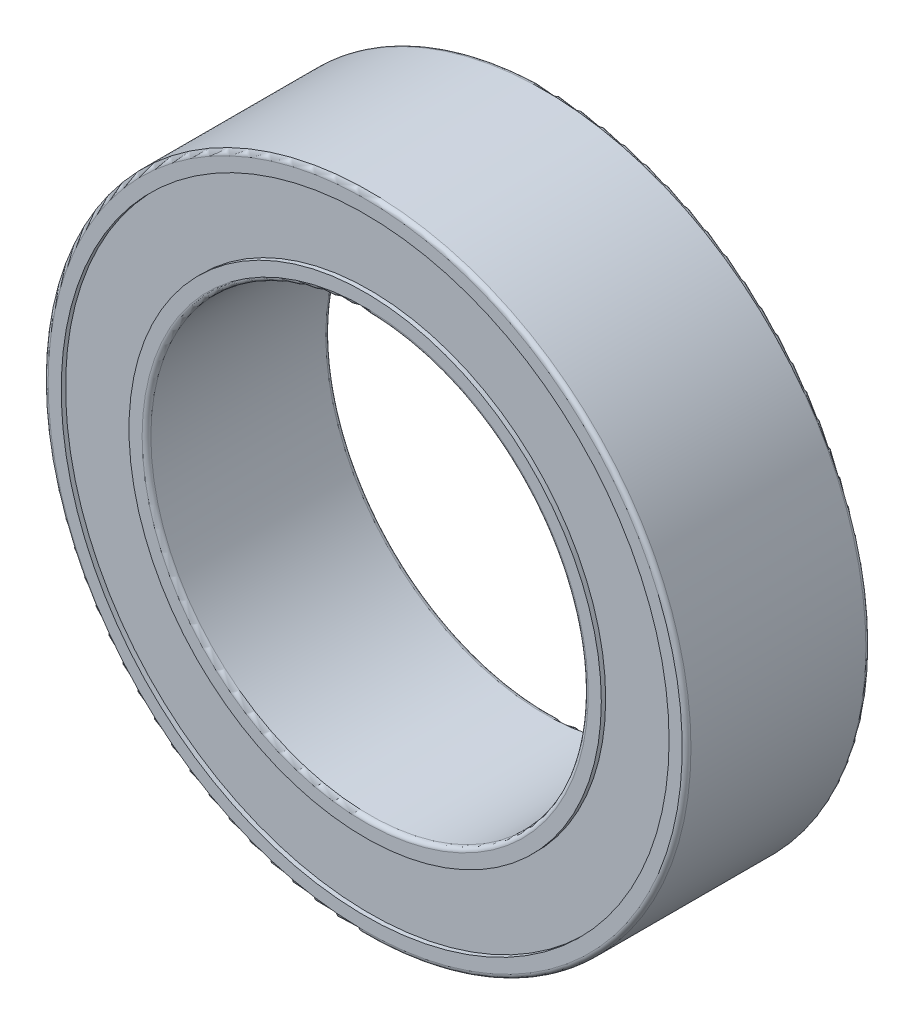
ISO-10303-21;
HEADER;
FILE_DESCRIPTION(('STEP AP214'),'2;1');
FILE_NAME('part.step','',(''),(''),'','','');
FILE_SCHEMA(('AUTOMOTIVE_DESIGN { 1 0 10303 214 1 1 1 1 }'));
ENDSEC;
DATA;
#1=APPLICATION_CONTEXT('core data for automotive mechanical design processes');
#2=APPLICATION_PROTOCOL_DEFINITION('international standard','automotive_design',2000,#1);
#3=PRODUCT_CONTEXT('',#1,'mechanical');
#4=PRODUCT('Part','Part','',(#3));
#5=PRODUCT_RELATED_PRODUCT_CATEGORY('part','',(#4));
#6=PRODUCT_DEFINITION_FORMATION('','',#4);
#7=PRODUCT_DEFINITION_CONTEXT('part definition',#1,'design');
#8=PRODUCT_DEFINITION('design','',#6,#7);
#9=PRODUCT_DEFINITION_SHAPE('','',#8);
#10=(LENGTH_UNIT() NAMED_UNIT(*) SI_UNIT(.MILLI.,.METRE.));
#11=(NAMED_UNIT(*) PLANE_ANGLE_UNIT() SI_UNIT($,.RADIAN.));
#12=(NAMED_UNIT(*) SI_UNIT($,.STERADIAN.) SOLID_ANGLE_UNIT());
#13=UNCERTAINTY_MEASURE_WITH_UNIT(LENGTH_MEASURE(1.E-05),#10,'distance_accuracy_value','');
#14=(GEOMETRIC_REPRESENTATION_CONTEXT(3) GLOBAL_UNCERTAINTY_ASSIGNED_CONTEXT((#13)) GLOBAL_UNIT_ASSIGNED_CONTEXT((#10,
#11,#12)) REPRESENTATION_CONTEXT('',''));
#15=CARTESIAN_POINT('',(0.,0.,0.));
#16=DIRECTION('',(0.,0.,1.));
#17=DIRECTION('',(1.,0.,0.));
#18=AXIS2_PLACEMENT_3D('',#15,#16,#17);
#19=CARTESIAN_POINT('',(0.,0.,14.88));
#20=DIRECTION('',(0.,0.,1.));
#21=DIRECTION('',(1.,0.,0.));
#22=AXIS2_PLACEMENT_3D('',#19,#20,#21);
#23=CYLINDRICAL_SURFACE('',#22,5.);
#24=CARTESIAN_POINT('',(0.,0.,2.));
#25=DIRECTION('',(0.,0.,-1.));
#26=DIRECTION('',(-1.,0.,0.));
#27=AXIS2_PLACEMENT_3D('',#24,#25,#26);
#28=CIRCLE('',#27,5.);
#29=CARTESIAN_POINT('',(-5.,0.,2.));
#30=VERTEX_POINT('',#29);
#31=EDGE_CURVE('E63',#30,#30,#28,.F.);
#32=ORIENTED_EDGE('',*,*,#31,.T.);
#33=EDGE_LOOP('',(#32));
#34=FACE_BOUND('',#33,.T.);
#35=CARTESIAN_POINT('',(0.,0.,-2.));
#36=DIRECTION('',(0.,0.,1.));
#37=DIRECTION('',(1.,0.,0.));
#38=AXIS2_PLACEMENT_3D('',#35,#36,#37);
#39=CIRCLE('',#38,5.);
#40=CARTESIAN_POINT('',(5.,0.,-2.));
#41=VERTEX_POINT('',#40);
#42=EDGE_CURVE('E66',#41,#41,#39,.F.);
#43=ORIENTED_EDGE('',*,*,#42,.T.);
#44=EDGE_LOOP('',(#43));
#45=FACE_BOUND('',#44,.T.);
#46=ADVANCED_FACE('F37',(#34,#45),#23,.F.);
#47=CARTESIAN_POINT('',(0.,5.,-2.1));
#48=DIRECTION('',(0.,0.,1.));
#49=DIRECTION('',(1.,0.,0.));
#50=AXIS2_PLACEMENT_3D('',#47,#48,#49);
#51=PLANE('',#50);
#52=CARTESIAN_POINT('',(0.,0.,-2.1));
#53=DIRECTION('',(0.,0.,1.));
#54=DIRECTION('',(1.,0.,0.));
#55=AXIS2_PLACEMENT_3D('',#52,#53,#54);
#56=CIRCLE('',#55,5.1);
#57=CARTESIAN_POINT('',(5.1,0.,-2.1));
#58=VERTEX_POINT('',#57);
#59=EDGE_CURVE('E57',#58,#58,#56,.T.);
#60=ORIENTED_EDGE('',*,*,#59,.T.);
#61=EDGE_LOOP('',(#60));
#62=FACE_BOUND('',#61,.T.);
#63=CARTESIAN_POINT('',(0.,0.,-2.1));
#64=DIRECTION('',(0.,0.,1.));
#65=DIRECTION('',(1.,0.,0.));
#66=AXIS2_PLACEMENT_3D('',#63,#64,#65);
#67=CIRCLE('',#66,5.4);
#68=CARTESIAN_POINT('',(5.4,0.,-2.1));
#69=VERTEX_POINT('',#68);
#70=EDGE_CURVE('E69',#69,#69,#67,.T.);
#71=ORIENTED_EDGE('',*,*,#70,.F.);
#72=EDGE_LOOP('',(#71));
#73=FACE_BOUND('',#72,.T.);
#74=ADVANCED_FACE('F125',(#62,#73),#51,.F.);
#75=CARTESIAN_POINT('',(0.,0.,14.88));
#76=DIRECTION('',(0.,0.,1.));
#77=DIRECTION('',(1.,0.,0.));
#78=AXIS2_PLACEMENT_3D('',#75,#76,#77);
#79=CYLINDRICAL_SURFACE('',#78,5.4);
#80=CARTESIAN_POINT('',(0.,0.,-2.));
#81=DIRECTION('',(0.,0.,1.));
#82=DIRECTION('',(1.,0.,0.));
#83=AXIS2_PLACEMENT_3D('',#80,#81,#82);
#84=CIRCLE('',#83,5.4);
#85=CARTESIAN_POINT('',(5.4,0.,-2.));
#86=VERTEX_POINT('',#85);
#87=EDGE_CURVE('E72',#86,#86,#84,.T.);
#88=ORIENTED_EDGE('',*,*,#87,.F.);
#89=EDGE_LOOP('',(#88));
#90=FACE_BOUND('',#89,.T.);
#91=ORIENTED_EDGE('',*,*,#70,.T.);
#92=EDGE_LOOP('',(#91));
#93=FACE_BOUND('',#92,.T.);
#94=ADVANCED_FACE('F131',(#90,#93),#79,.T.);
#95=CARTESIAN_POINT('',(0.,5.4,-2.));
#96=DIRECTION('',(0.,0.,1.));
#97=DIRECTION('',(1.,0.,0.));
#98=AXIS2_PLACEMENT_3D('',#95,#96,#97);
#99=PLANE('',#98);
#100=CARTESIAN_POINT('',(0.,0.,-2.));
#101=DIRECTION('',(0.,0.,1.));
#102=DIRECTION('',(1.,0.,0.));
#103=AXIS2_PLACEMENT_3D('',#100,#101,#102);
#104=CIRCLE('',#103,6.95);
#105=CARTESIAN_POINT('',(6.95,0.,-2.));
#106=VERTEX_POINT('',#105);
#107=EDGE_CURVE('E75',#106,#106,#104,.T.);
#108=ORIENTED_EDGE('',*,*,#107,.F.);
#109=EDGE_LOOP('',(#108));
#110=FACE_BOUND('',#109,.T.);
#111=ORIENTED_EDGE('',*,*,#87,.T.);
#112=EDGE_LOOP('',(#111));
#113=FACE_BOUND('',#112,.T.);
#114=ADVANCED_FACE('F256',(#110,#113),#99,.F.);
#115=CARTESIAN_POINT('',(0.,0.,14.88));
#116=DIRECTION('',(0.,0.,1.));
#117=DIRECTION('',(1.,0.,0.));
#118=AXIS2_PLACEMENT_3D('',#115,#116,#117);
#119=CYLINDRICAL_SURFACE('',#118,6.95);
#120=CARTESIAN_POINT('',(0.,0.,-2.1));
#121=DIRECTION('',(0.,0.,1.));
#122=DIRECTION('',(1.,0.,0.));
#123=AXIS2_PLACEMENT_3D('',#120,#121,#122);
#124=CIRCLE('',#123,6.95);
#125=CARTESIAN_POINT('',(6.95,0.,-2.1));
#126=VERTEX_POINT('',#125);
#127=EDGE_CURVE('E78',#126,#126,#124,.T.);
#128=ORIENTED_EDGE('',*,*,#127,.F.);
#129=EDGE_LOOP('',(#128));
#130=FACE_BOUND('',#129,.T.);
#131=ORIENTED_EDGE('',*,*,#107,.T.);
#132=EDGE_LOOP('',(#131));
#133=FACE_BOUND('',#132,.T.);
#134=ADVANCED_FACE('F211',(#130,#133),#119,.F.);
#135=CARTESIAN_POINT('',(0.,6.95,-2.1));
#136=DIRECTION('',(0.,0.,1.));
#137=DIRECTION('',(1.,0.,0.));
#138=AXIS2_PLACEMENT_3D('',#135,#136,#137);
#139=PLANE('',#138);
#140=CARTESIAN_POINT('',(0.,0.,-2.1));
#141=DIRECTION('',(0.,0.,1.));
#142=DIRECTION('',(1.,0.,0.));
#143=AXIS2_PLACEMENT_3D('',#140,#141,#142);
#144=CIRCLE('',#143,7.25);
#145=CARTESIAN_POINT('',(7.25,0.,-2.1));
#146=VERTEX_POINT('',#145);
#147=EDGE_CURVE('E44',#146,#146,#144,.F.);
#148=ORIENTED_EDGE('',*,*,#147,.T.);
#149=EDGE_LOOP('',(#148));
#150=FACE_BOUND('',#149,.T.);
#151=ORIENTED_EDGE('',*,*,#127,.T.);
#152=EDGE_LOOP('',(#151));
#153=FACE_BOUND('',#152,.T.);
#154=ADVANCED_FACE('F121',(#150,#153),#139,.F.);
#155=CARTESIAN_POINT('',(0.,0.,14.88));
#156=DIRECTION('',(0.,0.,1.));
#157=DIRECTION('',(1.,0.,0.));
#158=AXIS2_PLACEMENT_3D('',#155,#156,#157);
#159=CYLINDRICAL_SURFACE('',#158,7.35);
#160=CARTESIAN_POINT('',(0.,0.,-2.));
#161=DIRECTION('',(0.,0.,1.));
#162=DIRECTION('',(1.,0.,0.));
#163=AXIS2_PLACEMENT_3D('',#160,#161,#162);
#164=CIRCLE('',#163,7.35);
#165=CARTESIAN_POINT('',(7.35,0.,-2.));
#166=VERTEX_POINT('',#165);
#167=EDGE_CURVE('E48',#166,#166,#164,.T.);
#168=ORIENTED_EDGE('',*,*,#167,.T.);
#169=EDGE_LOOP('',(#168));
#170=FACE_BOUND('',#169,.T.);
#171=CARTESIAN_POINT('',(0.,0.,2.));
#172=DIRECTION('',(0.,0.,-1.));
#173=DIRECTION('',(-1.,0.,0.));
#174=AXIS2_PLACEMENT_3D('',#171,#172,#173);
#175=CIRCLE('',#174,7.35);
#176=CARTESIAN_POINT('',(-7.35,0.,2.));
#177=VERTEX_POINT('',#176);
#178=EDGE_CURVE('E52',#177,#177,#175,.T.);
#179=ORIENTED_EDGE('',*,*,#178,.T.);
#180=EDGE_LOOP('',(#179));
#181=FACE_BOUND('',#180,.T.);
#182=ADVANCED_FACE('F116',(#170,#181),#159,.T.);
#183=CARTESIAN_POINT('',(0.,6.95,2.1));
#184=DIRECTION('',(0.,0.,-1.));
#185=DIRECTION('',(-1.,0.,0.));
#186=AXIS2_PLACEMENT_3D('',#183,#184,#185);
#187=PLANE('',#186);
#188=CARTESIAN_POINT('',(0.,0.,2.1));
#189=DIRECTION('',(0.,0.,-1.));
#190=DIRECTION('',(-1.,0.,0.));
#191=AXIS2_PLACEMENT_3D('',#188,#189,#190);
#192=CIRCLE('',#191,7.25);
#193=CARTESIAN_POINT('',(-7.25,0.,2.1));
#194=VERTEX_POINT('',#193);
#195=EDGE_CURVE('E10',#194,#194,#192,.F.);
#196=ORIENTED_EDGE('',*,*,#195,.T.);
#197=EDGE_LOOP('',(#196));
#198=FACE_BOUND('',#197,.T.);
#199=CARTESIAN_POINT('',(0.,0.,2.1));
#200=DIRECTION('',(0.,0.,1.));
#201=DIRECTION('',(1.,0.,0.));
#202=AXIS2_PLACEMENT_3D('',#199,#200,#201);
#203=CIRCLE('',#202,6.95);
#204=CARTESIAN_POINT('',(6.95,0.,2.1));
#205=VERTEX_POINT('',#204);
#206=EDGE_CURVE('E81',#205,#205,#203,.T.);
#207=ORIENTED_EDGE('',*,*,#206,.F.);
#208=EDGE_LOOP('',(#207));
#209=FACE_BOUND('',#208,.T.);
#210=ADVANCED_FACE('F111',(#198,#209),#187,.F.);
#211=CARTESIAN_POINT('',(0.,0.,14.88));
#212=DIRECTION('',(0.,0.,1.));
#213=DIRECTION('',(1.,0.,0.));
#214=AXIS2_PLACEMENT_3D('',#211,#212,#213);
#215=CYLINDRICAL_SURFACE('',#214,6.95);
#216=CARTESIAN_POINT('',(0.,0.,2.));
#217=DIRECTION('',(0.,0.,1.));
#218=DIRECTION('',(1.,0.,0.));
#219=AXIS2_PLACEMENT_3D('',#216,#217,#218);
#220=CIRCLE('',#219,6.95);
#221=CARTESIAN_POINT('',(6.95,0.,2.));
#222=VERTEX_POINT('',#221);
#223=EDGE_CURVE('E84',#222,#222,#220,.T.);
#224=ORIENTED_EDGE('',*,*,#223,.F.);
#225=EDGE_LOOP('',(#224));
#226=FACE_BOUND('',#225,.T.);
#227=ORIENTED_EDGE('',*,*,#206,.T.);
#228=EDGE_LOOP('',(#227));
#229=FACE_BOUND('',#228,.T.);
#230=ADVANCED_FACE('F105',(#226,#229),#215,.F.);
#231=CARTESIAN_POINT('',(0.,5.4,2.));
#232=DIRECTION('',(0.,0.,-1.));
#233=DIRECTION('',(-1.,0.,0.));
#234=AXIS2_PLACEMENT_3D('',#231,#232,#233);
#235=PLANE('',#234);
#236=CARTESIAN_POINT('',(0.,0.,2.));
#237=DIRECTION('',(0.,0.,1.));
#238=DIRECTION('',(1.,0.,0.));
#239=AXIS2_PLACEMENT_3D('',#236,#237,#238);
#240=CIRCLE('',#239,5.4);
#241=CARTESIAN_POINT('',(5.4,0.,2.));
#242=VERTEX_POINT('',#241);
#243=EDGE_CURVE('E87',#242,#242,#240,.T.);
#244=ORIENTED_EDGE('',*,*,#243,.F.);
#245=EDGE_LOOP('',(#244));
#246=FACE_BOUND('',#245,.T.);
#247=ORIENTED_EDGE('',*,*,#223,.T.);
#248=EDGE_LOOP('',(#247));
#249=FACE_BOUND('',#248,.T.);
#250=ADVANCED_FACE('F99',(#246,#249),#235,.F.);
#251=CARTESIAN_POINT('',(0.,0.,14.88));
#252=DIRECTION('',(0.,0.,1.));
#253=DIRECTION('',(1.,0.,0.));
#254=AXIS2_PLACEMENT_3D('',#251,#252,#253);
#255=CYLINDRICAL_SURFACE('',#254,5.4);
#256=CARTESIAN_POINT('',(0.,0.,2.1));
#257=DIRECTION('',(0.,0.,1.));
#258=DIRECTION('',(1.,0.,0.));
#259=AXIS2_PLACEMENT_3D('',#256,#257,#258);
#260=CIRCLE('',#259,5.4);
#261=CARTESIAN_POINT('',(5.4,0.,2.1));
#262=VERTEX_POINT('',#261);
#263=EDGE_CURVE('E90',#262,#262,#260,.T.);
#264=ORIENTED_EDGE('',*,*,#263,.F.);
#265=EDGE_LOOP('',(#264));
#266=FACE_BOUND('',#265,.T.);
#267=ORIENTED_EDGE('',*,*,#243,.T.);
#268=EDGE_LOOP('',(#267));
#269=FACE_BOUND('',#268,.T.);
#270=ADVANCED_FACE('F96',(#266,#269),#255,.T.);
#271=CARTESIAN_POINT('',(0.,5.,2.1));
#272=DIRECTION('',(0.,0.,-1.));
#273=DIRECTION('',(-1.,0.,0.));
#274=AXIS2_PLACEMENT_3D('',#271,#272,#273);
#275=PLANE('',#274);
#276=CARTESIAN_POINT('',(0.,0.,2.1));
#277=DIRECTION('',(0.,0.,-1.));
#278=DIRECTION('',(-1.,0.,0.));
#279=AXIS2_PLACEMENT_3D('',#276,#277,#278);
#280=CIRCLE('',#279,5.1);
#281=CARTESIAN_POINT('',(-5.1,0.,2.1));
#282=VERTEX_POINT('',#281);
#283=EDGE_CURVE('E60',#282,#282,#280,.T.);
#284=ORIENTED_EDGE('',*,*,#283,.T.);
#285=EDGE_LOOP('',(#284));
#286=FACE_BOUND('',#285,.T.);
#287=ORIENTED_EDGE('',*,*,#263,.T.);
#288=EDGE_LOOP('',(#287));
#289=FACE_BOUND('',#288,.T.);
#290=ADVANCED_FACE('F94',(#286,#289),#275,.F.);
#291=CARTESIAN_POINT('',(0.,0.,2.));
#292=DIRECTION('',(0.,0.,-1.));
#293=DIRECTION('',(-1.,0.,0.));
#294=AXIS2_PLACEMENT_3D('',#291,#292,#293);
#295=TOROIDAL_SURFACE('',#294,5.1,0.1);
#296=ORIENTED_EDGE('',*,*,#283,.F.);
#297=EDGE_LOOP('',(#296));
#298=FACE_BOUND('',#297,.T.);
#299=ORIENTED_EDGE('',*,*,#31,.F.);
#300=EDGE_LOOP('',(#299));
#301=FACE_BOUND('',#300,.T.);
#302=ADVANCED_FACE('F137',(#298,#301),#295,.T.);
#303=CARTESIAN_POINT('',(0.,0.,-2.));
#304=DIRECTION('',(0.,0.,1.));
#305=DIRECTION('',(1.,0.,0.));
#306=AXIS2_PLACEMENT_3D('',#303,#304,#305);
#307=TOROIDAL_SURFACE('',#306,5.1,0.1);
#308=ORIENTED_EDGE('',*,*,#42,.F.);
#309=EDGE_LOOP('',(#308));
#310=FACE_BOUND('',#309,.T.);
#311=ORIENTED_EDGE('',*,*,#59,.F.);
#312=EDGE_LOOP('',(#311));
#313=FACE_BOUND('',#312,.T.);
#314=ADVANCED_FACE('F140',(#310,#313),#307,.T.);
#315=CARTESIAN_POINT('',(0.,0.,-2.));
#316=DIRECTION('',(0.,0.,1.));
#317=DIRECTION('',(1.,0.,0.));
#318=AXIS2_PLACEMENT_3D('',#315,#316,#317);
#319=TOROIDAL_SURFACE('',#318,7.25,0.1);
#320=ORIENTED_EDGE('',*,*,#147,.F.);
#321=EDGE_LOOP('',(#320));
#322=FACE_BOUND('',#321,.T.);
#323=ORIENTED_EDGE('',*,*,#167,.F.);
#324=EDGE_LOOP('',(#323));
#325=FACE_BOUND('',#324,.T.);
#326=ADVANCED_FACE('F143',(#322,#325),#319,.T.);
#327=CARTESIAN_POINT('',(0.,0.,2.));
#328=DIRECTION('',(0.,0.,-1.));
#329=DIRECTION('',(-1.,0.,0.));
#330=AXIS2_PLACEMENT_3D('',#327,#328,#329);
#331=TOROIDAL_SURFACE('',#330,7.25,0.1);
#332=ORIENTED_EDGE('',*,*,#178,.F.);
#333=EDGE_LOOP('',(#332));
#334=FACE_BOUND('',#333,.T.);
#335=ORIENTED_EDGE('',*,*,#195,.F.);
#336=EDGE_LOOP('',(#335));
#337=FACE_BOUND('',#336,.T.);
#338=ADVANCED_FACE('F39',(#334,#337),#331,.T.);
#339=CLOSED_SHELL('',(#46,#74,#94,#114,#134,#154,#182,#210,#230,#250,#270,#290,#302,#314,#326,#338));
#340=MANIFOLD_SOLID_BREP('B2',#339);
#341=ADVANCED_BREP_SHAPE_REPRESENTATION('',(#18,#340),#14);
#342=SHAPE_DEFINITION_REPRESENTATION(#9,#341);
ENDSEC;
END-ISO-10303-21;
